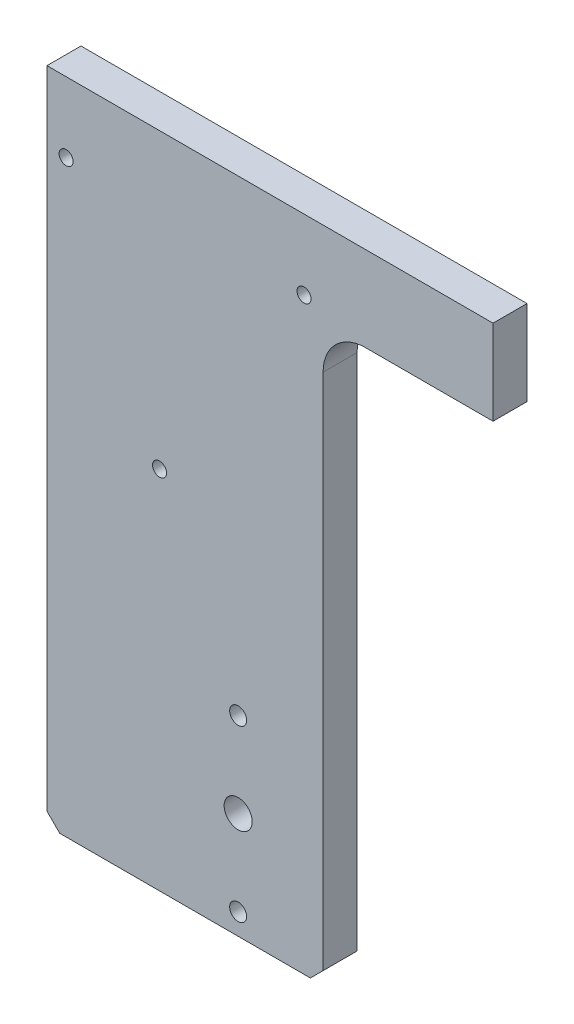
ISO-10303-21;
HEADER;
FILE_DESCRIPTION(('STEP AP214'),'2;1');
FILE_NAME('part.step','',(''),(''),'','','');
FILE_SCHEMA(('AUTOMOTIVE_DESIGN { 1 0 10303 214 1 1 1 1 }'));
ENDSEC;
DATA;
#1=APPLICATION_CONTEXT('core data for automotive mechanical design processes');
#2=APPLICATION_PROTOCOL_DEFINITION('international standard','automotive_design',2000,#1);
#3=PRODUCT_CONTEXT('',#1,'mechanical');
#4=PRODUCT('Part','Part','',(#3));
#5=PRODUCT_RELATED_PRODUCT_CATEGORY('part','',(#4));
#6=PRODUCT_DEFINITION_FORMATION('','',#4);
#7=PRODUCT_DEFINITION_CONTEXT('part definition',#1,'design');
#8=PRODUCT_DEFINITION('design','',#6,#7);
#9=PRODUCT_DEFINITION_SHAPE('','',#8);
#10=(LENGTH_UNIT() NAMED_UNIT(*) SI_UNIT(.MILLI.,.METRE.));
#11=(NAMED_UNIT(*) PLANE_ANGLE_UNIT() SI_UNIT($,.RADIAN.));
#12=(NAMED_UNIT(*) SI_UNIT($,.STERADIAN.) SOLID_ANGLE_UNIT());
#13=UNCERTAINTY_MEASURE_WITH_UNIT(LENGTH_MEASURE(1.E-05),#10,'distance_accuracy_value','');
#14=(GEOMETRIC_REPRESENTATION_CONTEXT(3) GLOBAL_UNCERTAINTY_ASSIGNED_CONTEXT((#13)) GLOBAL_UNIT_ASSIGNED_CONTEXT((#10,
#11,#12)) REPRESENTATION_CONTEXT('',''));
#15=CARTESIAN_POINT('',(0.,0.,0.));
#16=DIRECTION('',(0.,0.,1.));
#17=DIRECTION('',(1.,0.,0.));
#18=AXIS2_PLACEMENT_3D('',#15,#16,#17);
#19=CARTESIAN_POINT('',(42.5,47.5,0.));
#20=DIRECTION('',(0.,0.,1.));
#21=DIRECTION('',(1.,0.,0.));
#22=AXIS2_PLACEMENT_3D('',#19,#20,#21);
#23=PLANE('',#22);
#24=CARTESIAN_POINT('',(-28.,60.9998534839097,0.));
#25=DIRECTION('',(0.,0.,-1.));
#26=DIRECTION('',(-1.,0.,0.));
#27=AXIS2_PLACEMENT_3D('',#24,#25,#26);
#28=CIRCLE('',#27,1.64999999999999);
#29=CARTESIAN_POINT('',(-29.65,60.9998534839097,0.));
#30=VERTEX_POINT('',#29);
#31=EDGE_CURVE('E209',#30,#30,#28,.F.);
#32=ORIENTED_EDGE('',*,*,#31,.T.);
#33=EDGE_LOOP('',(#32));
#34=FACE_BOUND('',#33,.T.);
#35=CARTESIAN_POINT('',(28.,60.9998534839097,0.));
#36=DIRECTION('',(0.,0.,-1.));
#37=DIRECTION('',(-1.,0.,0.));
#38=AXIS2_PLACEMENT_3D('',#35,#36,#37);
#39=CIRCLE('',#38,1.64999999999999);
#40=CARTESIAN_POINT('',(26.35,60.9998534839097,0.));
#41=VERTEX_POINT('',#40);
#42=EDGE_CURVE('E212',#41,#41,#39,.F.);
#43=ORIENTED_EDGE('',*,*,#42,.T.);
#44=EDGE_LOOP('',(#43));
#45=FACE_BOUND('',#44,.T.);
#46=CARTESIAN_POINT('',(12.5,-52.5,0.));
#47=DIRECTION('',(0.,0.,-1.));
#48=DIRECTION('',(-1.,0.,0.));
#49=AXIS2_PLACEMENT_3D('',#46,#47,#48);
#50=CIRCLE('',#49,3.29999999999999);
#51=CARTESIAN_POINT('',(9.2,-52.5,0.));
#52=VERTEX_POINT('',#51);
#53=EDGE_CURVE('E215',#52,#52,#50,.F.);
#54=ORIENTED_EDGE('',*,*,#53,.T.);
#55=EDGE_LOOP('',(#54));
#56=FACE_BOUND('',#55,.T.);
#57=CARTESIAN_POINT('',(12.5,-72.5000000000001,0.));
#58=DIRECTION('',(0.,0.,-1.));
#59=DIRECTION('',(-1.,0.,0.));
#60=AXIS2_PLACEMENT_3D('',#57,#58,#59);
#61=CIRCLE('',#60,1.99499999999999);
#62=CARTESIAN_POINT('',(10.505,-72.5000000000001,0.));
#63=VERTEX_POINT('',#62);
#64=EDGE_CURVE('E218',#63,#63,#61,.F.);
#65=ORIENTED_EDGE('',*,*,#64,.T.);
#66=EDGE_LOOP('',(#65));
#67=FACE_BOUND('',#66,.T.);
#68=CARTESIAN_POINT('',(12.5,-32.5,0.));
#69=DIRECTION('',(0.,0.,-1.));
#70=DIRECTION('',(-1.,0.,0.));
#71=AXIS2_PLACEMENT_3D('',#68,#69,#70);
#72=CIRCLE('',#71,1.99499999999999);
#73=CARTESIAN_POINT('',(10.505,-32.5,0.));
#74=VERTEX_POINT('',#73);
#75=EDGE_CURVE('E170',#74,#74,#72,.F.);
#76=ORIENTED_EDGE('',*,*,#75,.T.);
#77=EDGE_LOOP('',(#76));
#78=FACE_BOUND('',#77,.T.);
#79=DIRECTION('',(-0.707106781186548,0.707106781186548,0.));
#80=VECTOR('',#79,1.);
#81=CARTESIAN_POINT('',(-29.5,-77.5,0.));
#82=LINE('',#81,#80);
#83=CARTESIAN_POINT('',(-29.5,-77.5,0.));
#84=VERTEX_POINT('',#83);
#85=CARTESIAN_POINT('',(-32.5,-74.5,0.));
#86=VERTEX_POINT('',#85);
#87=EDGE_CURVE('E143',#84,#86,#82,.T.);
#88=ORIENTED_EDGE('',*,*,#87,.T.);
#89=DIRECTION('',(0.,1.,0.));
#90=VECTOR('',#89,1.);
#91=CARTESIAN_POINT('',(-32.5,-77.5,0.));
#92=LINE('',#91,#90);
#93=CARTESIAN_POINT('',(-32.5,77.5,0.));
#94=VERTEX_POINT('',#93);
#95=EDGE_CURVE('E164',#86,#94,#92,.T.);
#96=ORIENTED_EDGE('',*,*,#95,.T.);
#97=DIRECTION('',(1.,0.,0.));
#98=VECTOR('',#97,1.);
#99=CARTESIAN_POINT('',(32.5,77.5,0.));
#100=LINE('',#99,#98);
#101=CARTESIAN_POINT('',(72.5,77.5,0.));
#102=VERTEX_POINT('',#101);
#103=EDGE_CURVE('E154',#94,#102,#100,.T.);
#104=ORIENTED_EDGE('',*,*,#103,.T.);
#105=DIRECTION('',(0.,1.,0.));
#106=VECTOR('',#105,1.);
#107=CARTESIAN_POINT('',(72.5,77.5,0.));
#108=LINE('',#107,#106);
#109=CARTESIAN_POINT('',(72.5,57.5,0.));
#110=VERTEX_POINT('',#109);
#111=EDGE_CURVE('E177',#102,#110,#108,.F.);
#112=ORIENTED_EDGE('',*,*,#111,.T.);
#113=DIRECTION('',(1.,0.,0.));
#114=VECTOR('',#113,1.);
#115=CARTESIAN_POINT('',(72.5,57.5,0.));
#116=LINE('',#115,#114);
#117=CARTESIAN_POINT('',(42.5,57.5,0.));
#118=VERTEX_POINT('',#117);
#119=EDGE_CURVE('E100',#110,#118,#116,.F.);
#120=ORIENTED_EDGE('',*,*,#119,.T.);
#121=CARTESIAN_POINT('',(42.5,47.5,0.));
#122=DIRECTION('',(0.,0.,-1.));
#123=DIRECTION('',(-1.,0.,0.));
#124=AXIS2_PLACEMENT_3D('',#121,#122,#123);
#125=CIRCLE('',#124,10.);
#126=CARTESIAN_POINT('',(32.5,47.5,0.));
#127=VERTEX_POINT('',#126);
#128=EDGE_CURVE('E19',#118,#127,#125,.F.);
#129=ORIENTED_EDGE('',*,*,#128,.T.);
#130=DIRECTION('',(0.,1.,0.));
#131=VECTOR('',#130,1.);
#132=CARTESIAN_POINT('',(32.5,-77.5,0.));
#133=LINE('',#132,#131);
#134=CARTESIAN_POINT('',(32.5,-74.5,0.));
#135=VERTEX_POINT('',#134);
#136=EDGE_CURVE('E88',#127,#135,#133,.F.);
#137=ORIENTED_EDGE('',*,*,#136,.T.);
#138=DIRECTION('',(-0.707106781186548,-0.707106781186548,0.));
#139=VECTOR('',#138,1.);
#140=CARTESIAN_POINT('',(32.5,-74.5,0.));
#141=LINE('',#140,#139);
#142=CARTESIAN_POINT('',(29.5,-77.5,0.));
#143=VERTEX_POINT('',#142);
#144=EDGE_CURVE('E123',#135,#143,#141,.T.);
#145=ORIENTED_EDGE('',*,*,#144,.T.);
#146=DIRECTION('',(1.,0.,0.));
#147=VECTOR('',#146,1.);
#148=CARTESIAN_POINT('',(32.5,-77.5,0.));
#149=LINE('',#148,#147);
#150=EDGE_CURVE('E133',#143,#84,#149,.F.);
#151=ORIENTED_EDGE('',*,*,#150,.T.);
#152=EDGE_LOOP('',(#88,#96,#104,#112,#120,#129,#137,#145,#151));
#153=FACE_BOUND('',#152,.T.);
#154=CARTESIAN_POINT('',(-6.00000000000001,8.49985348391005,0.));
#155=DIRECTION('',(0.,0.,-1.));
#156=DIRECTION('',(-1.,0.,0.));
#157=AXIS2_PLACEMENT_3D('',#154,#155,#156);
#158=CIRCLE('',#157,1.64999999999999);
#159=CARTESIAN_POINT('',(-7.65000000000001,8.49985348391005,0.));
#160=VERTEX_POINT('',#159);
#161=EDGE_CURVE('E148',#160,#160,#158,.F.);
#162=ORIENTED_EDGE('',*,*,#161,.T.);
#163=EDGE_LOOP('',(#162));
#164=FACE_BOUND('',#163,.T.);
#165=ADVANCED_FACE('F16',(#34,#45,#56,#67,#78,#153,#164),#23,.F.);
#166=CARTESIAN_POINT('',(-32.5,-77.5,8.));
#167=DIRECTION('',(1.,0.,0.));
#168=DIRECTION('',(0.,0.,-1.));
#169=AXIS2_PLACEMENT_3D('',#166,#167,#168);
#170=PLANE('',#169);
#171=DIRECTION('',(0.,0.,1.));
#172=VECTOR('',#171,1.);
#173=CARTESIAN_POINT('',(-32.5,-74.5,8.));
#174=LINE('',#173,#172);
#175=CARTESIAN_POINT('',(-32.5,-74.5,8.));
#176=VERTEX_POINT('',#175);
#177=EDGE_CURVE('E141',#86,#176,#174,.T.);
#178=ORIENTED_EDGE('',*,*,#177,.T.);
#179=DIRECTION('',(0.,1.,0.));
#180=VECTOR('',#179,1.);
#181=CARTESIAN_POINT('',(-32.5,47.5,8.));
#182=LINE('',#181,#180);
#183=CARTESIAN_POINT('',(-32.5,77.5,8.));
#184=VERTEX_POINT('',#183);
#185=EDGE_CURVE('E138',#184,#176,#182,.F.);
#186=ORIENTED_EDGE('',*,*,#185,.F.);
#187=DIRECTION('',(0.,0.,-1.));
#188=VECTOR('',#187,1.);
#189=CARTESIAN_POINT('',(-32.5,77.5,8.));
#190=LINE('',#189,#188);
#191=EDGE_CURVE('E151',#184,#94,#190,.T.);
#192=ORIENTED_EDGE('',*,*,#191,.T.);
#193=ORIENTED_EDGE('',*,*,#95,.F.);
#194=EDGE_LOOP('',(#178,#186,#192,#193));
#195=FACE_BOUND('',#194,.T.);
#196=ADVANCED_FACE('F275',(#195),#170,.F.);
#197=CARTESIAN_POINT('',(-29.5,-77.5,8.));
#198=DIRECTION('',(0.707106781186548,0.707106781186548,0.));
#199=DIRECTION('',(-0.707106781186548,0.707106781186548,0.));
#200=AXIS2_PLACEMENT_3D('',#197,#198,#199);
#201=PLANE('',#200);
#202=ORIENTED_EDGE('',*,*,#177,.F.);
#203=ORIENTED_EDGE('',*,*,#87,.F.);
#204=DIRECTION('',(0.,0.,1.));
#205=VECTOR('',#204,1.);
#206=CARTESIAN_POINT('',(-29.5,-77.5,8.));
#207=LINE('',#206,#205);
#208=CARTESIAN_POINT('',(-29.5,-77.5,8.));
#209=VERTEX_POINT('',#208);
#210=EDGE_CURVE('E131',#84,#209,#207,.T.);
#211=ORIENTED_EDGE('',*,*,#210,.T.);
#212=DIRECTION('',(0.707106781186551,-0.707106781186544,0.));
#213=VECTOR('',#212,1.);
#214=CARTESIAN_POINT('',(-32.5,-74.5,8.));
#215=LINE('',#214,#213);
#216=EDGE_CURVE('E128',#176,#209,#215,.T.);
#217=ORIENTED_EDGE('',*,*,#216,.F.);
#218=EDGE_LOOP('',(#202,#203,#211,#217));
#219=FACE_BOUND('',#218,.T.);
#220=ADVANCED_FACE('F273',(#219),#201,.F.);
#221=CARTESIAN_POINT('',(32.5,-77.5,8.));
#222=DIRECTION('',(0.,1.,0.));
#223=DIRECTION('',(0.,0.,1.));
#224=AXIS2_PLACEMENT_3D('',#221,#222,#223);
#225=PLANE('',#224);
#226=ORIENTED_EDGE('',*,*,#210,.F.);
#227=ORIENTED_EDGE('',*,*,#150,.F.);
#228=DIRECTION('',(0.,0.,1.));
#229=VECTOR('',#228,1.);
#230=CARTESIAN_POINT('',(29.5,-77.5,8.));
#231=LINE('',#230,#229);
#232=CARTESIAN_POINT('',(29.5,-77.5,8.));
#233=VERTEX_POINT('',#232);
#234=EDGE_CURVE('E96',#143,#233,#231,.T.);
#235=ORIENTED_EDGE('',*,*,#234,.T.);
#236=DIRECTION('',(1.,0.,0.));
#237=VECTOR('',#236,1.);
#238=CARTESIAN_POINT('',(42.5,-77.5,8.));
#239=LINE('',#238,#237);
#240=EDGE_CURVE('E119',#209,#233,#239,.T.);
#241=ORIENTED_EDGE('',*,*,#240,.F.);
#242=EDGE_LOOP('',(#226,#227,#235,#241));
#243=FACE_BOUND('',#242,.T.);
#244=ADVANCED_FACE('F269',(#243),#225,.F.);
#245=CARTESIAN_POINT('',(32.5,-74.5,8.));
#246=DIRECTION('',(-0.707106781186548,0.707106781186548,0.));
#247=DIRECTION('',(-0.707106781186548,-0.707106781186548,0.));
#248=AXIS2_PLACEMENT_3D('',#245,#246,#247);
#249=PLANE('',#248);
#250=ORIENTED_EDGE('',*,*,#234,.F.);
#251=ORIENTED_EDGE('',*,*,#144,.F.);
#252=DIRECTION('',(0.,0.,1.));
#253=VECTOR('',#252,1.);
#254=CARTESIAN_POINT('',(32.5,-74.5,8.));
#255=LINE('',#254,#253);
#256=CARTESIAN_POINT('',(32.5,-74.5,8.));
#257=VERTEX_POINT('',#256);
#258=EDGE_CURVE('E93',#135,#257,#255,.T.);
#259=ORIENTED_EDGE('',*,*,#258,.T.);
#260=DIRECTION('',(0.707106781186549,0.707106781186546,0.));
#261=VECTOR('',#260,1.);
#262=CARTESIAN_POINT('',(29.4999999999999,-77.5,8.));
#263=LINE('',#262,#261);
#264=EDGE_CURVE('E115',#233,#257,#263,.T.);
#265=ORIENTED_EDGE('',*,*,#264,.F.);
#266=EDGE_LOOP('',(#250,#251,#259,#265));
#267=FACE_BOUND('',#266,.T.);
#268=ADVANCED_FACE('F264',(#267),#249,.F.);
#269=CARTESIAN_POINT('',(32.5,-77.5,8.));
#270=DIRECTION('',(-1.,0.,0.));
#271=DIRECTION('',(0.,0.,1.));
#272=AXIS2_PLACEMENT_3D('',#269,#270,#271);
#273=PLANE('',#272);
#274=ORIENTED_EDGE('',*,*,#258,.F.);
#275=ORIENTED_EDGE('',*,*,#136,.F.);
#276=DIRECTION('',(0.,0.,-1.));
#277=VECTOR('',#276,1.);
#278=CARTESIAN_POINT('',(32.5,47.5,8.));
#279=LINE('',#278,#277);
#280=CARTESIAN_POINT('',(32.5,47.5,8.));
#281=VERTEX_POINT('',#280);
#282=EDGE_CURVE('E91',#127,#281,#279,.F.);
#283=ORIENTED_EDGE('',*,*,#282,.T.);
#284=DIRECTION('',(0.,1.,0.));
#285=VECTOR('',#284,1.);
#286=CARTESIAN_POINT('',(32.5,47.5,8.));
#287=LINE('',#286,#285);
#288=EDGE_CURVE('E118',#257,#281,#287,.T.);
#289=ORIENTED_EDGE('',*,*,#288,.F.);
#290=EDGE_LOOP('',(#274,#275,#283,#289));
#291=FACE_BOUND('',#290,.T.);
#292=ADVANCED_FACE('F89',(#291),#273,.F.);
#293=CARTESIAN_POINT('',(42.5,47.5,8.));
#294=DIRECTION('',(0.,0.,-1.));
#295=DIRECTION('',(-1.,0.,0.));
#296=AXIS2_PLACEMENT_3D('',#293,#294,#295);
#297=CYLINDRICAL_SURFACE('',#296,10.);
#298=DIRECTION('',(0.,0.,1.));
#299=VECTOR('',#298,1.);
#300=CARTESIAN_POINT('',(42.5,57.5,8.));
#301=LINE('',#300,#299);
#302=CARTESIAN_POINT('',(42.5,57.5,8.));
#303=VERTEX_POINT('',#302);
#304=EDGE_CURVE('E102',#118,#303,#301,.T.);
#305=ORIENTED_EDGE('',*,*,#304,.T.);
#306=CARTESIAN_POINT('',(42.5,47.5,8.));
#307=DIRECTION('',(0.,0.,-1.));
#308=DIRECTION('',(-1.,0.,0.));
#309=AXIS2_PLACEMENT_3D('',#306,#307,#308);
#310=CIRCLE('',#309,10.);
#311=EDGE_CURVE('E105',#281,#303,#310,.T.);
#312=ORIENTED_EDGE('',*,*,#311,.F.);
#313=ORIENTED_EDGE('',*,*,#282,.F.);
#314=ORIENTED_EDGE('',*,*,#128,.F.);
#315=EDGE_LOOP('',(#305,#312,#313,#314));
#316=FACE_BOUND('',#315,.T.);
#317=ADVANCED_FACE('F103',(#316),#297,.F.);
#318=CARTESIAN_POINT('',(72.5,57.5,8.));
#319=DIRECTION('',(0.,1.,0.));
#320=DIRECTION('',(0.,0.,1.));
#321=AXIS2_PLACEMENT_3D('',#318,#319,#320);
#322=PLANE('',#321);
#323=DIRECTION('',(0.,0.,1.));
#324=VECTOR('',#323,1.);
#325=CARTESIAN_POINT('',(72.5,57.5,8.));
#326=LINE('',#325,#324);
#327=CARTESIAN_POINT('',(72.5,57.5,8.));
#328=VERTEX_POINT('',#327);
#329=EDGE_CURVE('E174',#110,#328,#326,.T.);
#330=ORIENTED_EDGE('',*,*,#329,.T.);
#331=DIRECTION('',(1.,0.,0.));
#332=VECTOR('',#331,1.);
#333=CARTESIAN_POINT('',(42.5,57.5,8.));
#334=LINE('',#333,#332);
#335=EDGE_CURVE('E206',#303,#328,#334,.T.);
#336=ORIENTED_EDGE('',*,*,#335,.F.);
#337=ORIENTED_EDGE('',*,*,#304,.F.);
#338=ORIENTED_EDGE('',*,*,#119,.F.);
#339=EDGE_LOOP('',(#330,#336,#337,#338));
#340=FACE_BOUND('',#339,.T.);
#341=ADVANCED_FACE('F249',(#340),#322,.F.);
#342=CARTESIAN_POINT('',(72.5,77.5,8.));
#343=DIRECTION('',(-1.,0.,0.));
#344=DIRECTION('',(0.,0.,1.));
#345=AXIS2_PLACEMENT_3D('',#342,#343,#344);
#346=PLANE('',#345);
#347=DIRECTION('',(0.,0.,-1.));
#348=VECTOR('',#347,1.);
#349=CARTESIAN_POINT('',(72.5,77.5,8.));
#350=LINE('',#349,#348);
#351=CARTESIAN_POINT('',(72.5,77.5,8.));
#352=VERTEX_POINT('',#351);
#353=EDGE_CURVE('E34',#102,#352,#350,.F.);
#354=ORIENTED_EDGE('',*,*,#353,.T.);
#355=DIRECTION('',(0.,1.,0.));
#356=VECTOR('',#355,1.);
#357=CARTESIAN_POINT('',(72.5,47.5,8.));
#358=LINE('',#357,#356);
#359=EDGE_CURVE('E161',#328,#352,#358,.T.);
#360=ORIENTED_EDGE('',*,*,#359,.F.);
#361=ORIENTED_EDGE('',*,*,#329,.F.);
#362=ORIENTED_EDGE('',*,*,#111,.F.);
#363=EDGE_LOOP('',(#354,#360,#361,#362));
#364=FACE_BOUND('',#363,.T.);
#365=ADVANCED_FACE('F250',(#364),#346,.F.);
#366=CARTESIAN_POINT('',(32.5,77.5,8.));
#367=DIRECTION('',(0.,-1.,0.));
#368=DIRECTION('',(0.,0.,-1.));
#369=AXIS2_PLACEMENT_3D('',#366,#367,#368);
#370=PLANE('',#369);
#371=ORIENTED_EDGE('',*,*,#191,.F.);
#372=DIRECTION('',(1.,0.,0.));
#373=VECTOR('',#372,1.);
#374=CARTESIAN_POINT('',(42.5,77.5,8.));
#375=LINE('',#374,#373);
#376=EDGE_CURVE('E157',#352,#184,#375,.F.);
#377=ORIENTED_EDGE('',*,*,#376,.F.);
#378=ORIENTED_EDGE('',*,*,#353,.F.);
#379=ORIENTED_EDGE('',*,*,#103,.F.);
#380=EDGE_LOOP('',(#371,#377,#378,#379));
#381=FACE_BOUND('',#380,.T.);
#382=ADVANCED_FACE('F228',(#381),#370,.F.);
#383=CARTESIAN_POINT('',(12.5,-32.5,0.));
#384=DIRECTION('',(0.,0.,-1.));
#385=DIRECTION('',(-1.,0.,0.));
#386=AXIS2_PLACEMENT_3D('',#383,#384,#385);
#387=CYLINDRICAL_SURFACE('',#386,1.99499999999999);
#388=ORIENTED_EDGE('',*,*,#75,.F.);
#389=EDGE_LOOP('',(#388));
#390=FACE_BOUND('',#389,.T.);
#391=CARTESIAN_POINT('',(12.5,-32.5,8.));
#392=DIRECTION('',(0.,0.,-1.));
#393=DIRECTION('',(-1.,0.,0.));
#394=AXIS2_PLACEMENT_3D('',#391,#392,#393);
#395=CIRCLE('',#394,1.99499999999999);
#396=CARTESIAN_POINT('',(10.505,-32.5,8.));
#397=VERTEX_POINT('',#396);
#398=EDGE_CURVE('E160',#397,#397,#395,.T.);
#399=ORIENTED_EDGE('',*,*,#398,.F.);
#400=EDGE_LOOP('',(#399));
#401=FACE_BOUND('',#400,.T.);
#402=ADVANCED_FACE('F224',(#390,#401),#387,.F.);
#403=CARTESIAN_POINT('',(12.5,-72.5000000000001,0.));
#404=DIRECTION('',(0.,0.,-1.));
#405=DIRECTION('',(-1.,0.,0.));
#406=AXIS2_PLACEMENT_3D('',#403,#404,#405);
#407=CYLINDRICAL_SURFACE('',#406,1.99499999999999);
#408=ORIENTED_EDGE('',*,*,#64,.F.);
#409=EDGE_LOOP('',(#408));
#410=FACE_BOUND('',#409,.T.);
#411=CARTESIAN_POINT('',(12.5,-72.5000000000001,8.));
#412=DIRECTION('',(0.,0.,-1.));
#413=DIRECTION('',(-1.,0.,0.));
#414=AXIS2_PLACEMENT_3D('',#411,#412,#413);
#415=CIRCLE('',#414,1.99499999999999);
#416=CARTESIAN_POINT('',(10.505,-72.5000000000001,8.));
#417=VERTEX_POINT('',#416);
#418=EDGE_CURVE('E200',#417,#417,#415,.T.);
#419=ORIENTED_EDGE('',*,*,#418,.F.);
#420=EDGE_LOOP('',(#419));
#421=FACE_BOUND('',#420,.T.);
#422=ADVANCED_FACE('F227',(#410,#421),#407,.F.);
#423=CARTESIAN_POINT('',(12.5,-52.5,0.));
#424=DIRECTION('',(0.,0.,-1.));
#425=DIRECTION('',(-1.,0.,0.));
#426=AXIS2_PLACEMENT_3D('',#423,#424,#425);
#427=CYLINDRICAL_SURFACE('',#426,3.29999999999999);
#428=ORIENTED_EDGE('',*,*,#53,.F.);
#429=EDGE_LOOP('',(#428));
#430=FACE_BOUND('',#429,.T.);
#431=CARTESIAN_POINT('',(12.5,-52.5,8.));
#432=DIRECTION('',(0.,0.,-1.));
#433=DIRECTION('',(-1.,0.,0.));
#434=AXIS2_PLACEMENT_3D('',#431,#432,#433);
#435=CIRCLE('',#434,3.29999999999999);
#436=CARTESIAN_POINT('',(9.2,-52.5,8.));
#437=VERTEX_POINT('',#436);
#438=EDGE_CURVE('E197',#437,#437,#435,.T.);
#439=ORIENTED_EDGE('',*,*,#438,.F.);
#440=EDGE_LOOP('',(#439));
#441=FACE_BOUND('',#440,.T.);
#442=ADVANCED_FACE('F301',(#430,#441),#427,.F.);
#443=CARTESIAN_POINT('',(28.,60.9998534839097,0.));
#444=DIRECTION('',(0.,0.,-1.));
#445=DIRECTION('',(-1.,0.,0.));
#446=AXIS2_PLACEMENT_3D('',#443,#444,#445);
#447=CYLINDRICAL_SURFACE('',#446,1.64999999999999);
#448=ORIENTED_EDGE('',*,*,#42,.F.);
#449=EDGE_LOOP('',(#448));
#450=FACE_BOUND('',#449,.T.);
#451=CARTESIAN_POINT('',(28.,60.9998534839097,8.));
#452=DIRECTION('',(0.,0.,-1.));
#453=DIRECTION('',(-1.,0.,0.));
#454=AXIS2_PLACEMENT_3D('',#451,#452,#453);
#455=CIRCLE('',#454,1.64999999999999);
#456=CARTESIAN_POINT('',(26.35,60.9998534839097,8.));
#457=VERTEX_POINT('',#456);
#458=EDGE_CURVE('E194',#457,#457,#455,.T.);
#459=ORIENTED_EDGE('',*,*,#458,.F.);
#460=EDGE_LOOP('',(#459));
#461=FACE_BOUND('',#460,.T.);
#462=ADVANCED_FACE('F305',(#450,#461),#447,.F.);
#463=CARTESIAN_POINT('',(-28.,60.9998534839097,0.));
#464=DIRECTION('',(0.,0.,-1.));
#465=DIRECTION('',(-1.,0.,0.));
#466=AXIS2_PLACEMENT_3D('',#463,#464,#465);
#467=CYLINDRICAL_SURFACE('',#466,1.64999999999999);
#468=ORIENTED_EDGE('',*,*,#31,.F.);
#469=EDGE_LOOP('',(#468));
#470=FACE_BOUND('',#469,.T.);
#471=CARTESIAN_POINT('',(-28.,60.9998534839097,8.));
#472=DIRECTION('',(0.,0.,-1.));
#473=DIRECTION('',(-1.,0.,0.));
#474=AXIS2_PLACEMENT_3D('',#471,#472,#473);
#475=CIRCLE('',#474,1.64999999999999);
#476=CARTESIAN_POINT('',(-29.65,60.9998534839097,8.));
#477=VERTEX_POINT('',#476);
#478=EDGE_CURVE('E25',#477,#477,#475,.T.);
#479=ORIENTED_EDGE('',*,*,#478,.F.);
#480=EDGE_LOOP('',(#479));
#481=FACE_BOUND('',#480,.T.);
#482=ADVANCED_FACE('F309',(#470,#481),#467,.F.);
#483=CARTESIAN_POINT('',(-6.00000000000001,8.49985348391005,0.));
#484=DIRECTION('',(0.,0.,-1.));
#485=DIRECTION('',(-1.,0.,0.));
#486=AXIS2_PLACEMENT_3D('',#483,#484,#485);
#487=CYLINDRICAL_SURFACE('',#486,1.64999999999999);
#488=ORIENTED_EDGE('',*,*,#161,.F.);
#489=EDGE_LOOP('',(#488));
#490=FACE_BOUND('',#489,.T.);
#491=CARTESIAN_POINT('',(-6.00000000000001,8.49985348391005,8.));
#492=DIRECTION('',(0.,0.,-1.));
#493=DIRECTION('',(-1.,0.,0.));
#494=AXIS2_PLACEMENT_3D('',#491,#492,#493);
#495=CIRCLE('',#494,1.64999999999999);
#496=CARTESIAN_POINT('',(-7.65000000000001,8.49985348391005,8.));
#497=VERTEX_POINT('',#496);
#498=EDGE_CURVE('E11',#497,#497,#495,.T.);
#499=ORIENTED_EDGE('',*,*,#498,.F.);
#500=EDGE_LOOP('',(#499));
#501=FACE_BOUND('',#500,.T.);
#502=ADVANCED_FACE('F235',(#490,#501),#487,.F.);
#503=CARTESIAN_POINT('',(42.5,47.5,8.));
#504=DIRECTION('',(0.,0.,1.));
#505=DIRECTION('',(1.,0.,0.));
#506=AXIS2_PLACEMENT_3D('',#503,#504,#505);
#507=PLANE('',#506);
#508=ORIENTED_EDGE('',*,*,#498,.T.);
#509=EDGE_LOOP('',(#508));
#510=FACE_BOUND('',#509,.T.);
#511=ORIENTED_EDGE('',*,*,#478,.T.);
#512=EDGE_LOOP('',(#511));
#513=FACE_BOUND('',#512,.T.);
#514=ORIENTED_EDGE('',*,*,#458,.T.);
#515=EDGE_LOOP('',(#514));
#516=FACE_BOUND('',#515,.T.);
#517=ORIENTED_EDGE('',*,*,#438,.T.);
#518=EDGE_LOOP('',(#517));
#519=FACE_BOUND('',#518,.T.);
#520=ORIENTED_EDGE('',*,*,#418,.T.);
#521=EDGE_LOOP('',(#520));
#522=FACE_BOUND('',#521,.T.);
#523=ORIENTED_EDGE('',*,*,#398,.T.);
#524=EDGE_LOOP('',(#523));
#525=FACE_BOUND('',#524,.T.);
#526=ORIENTED_EDGE('',*,*,#359,.T.);
#527=ORIENTED_EDGE('',*,*,#376,.T.);
#528=ORIENTED_EDGE('',*,*,#185,.T.);
#529=ORIENTED_EDGE('',*,*,#216,.T.);
#530=ORIENTED_EDGE('',*,*,#240,.T.);
#531=ORIENTED_EDGE('',*,*,#264,.T.);
#532=ORIENTED_EDGE('',*,*,#288,.T.);
#533=ORIENTED_EDGE('',*,*,#311,.T.);
#534=ORIENTED_EDGE('',*,*,#335,.T.);
#535=EDGE_LOOP('',(#526,#527,#528,#529,#530,#531,#532,#533,#534));
#536=FACE_BOUND('',#535,.T.);
#537=ADVANCED_FACE('F232',(#510,#513,#516,#519,#522,#525,#536),#507,.T.);
#538=CLOSED_SHELL('',(#165,#196,#220,#244,#268,#292,#317,#341,#365,#382,#402,#422,#442,#462,
#482,#502,#537));
#539=MANIFOLD_SOLID_BREP('B1',#538);
#540=ADVANCED_BREP_SHAPE_REPRESENTATION('',(#18,#539),#14);
#541=SHAPE_DEFINITION_REPRESENTATION(#9,#540);
ENDSEC;
END-ISO-10303-21;
